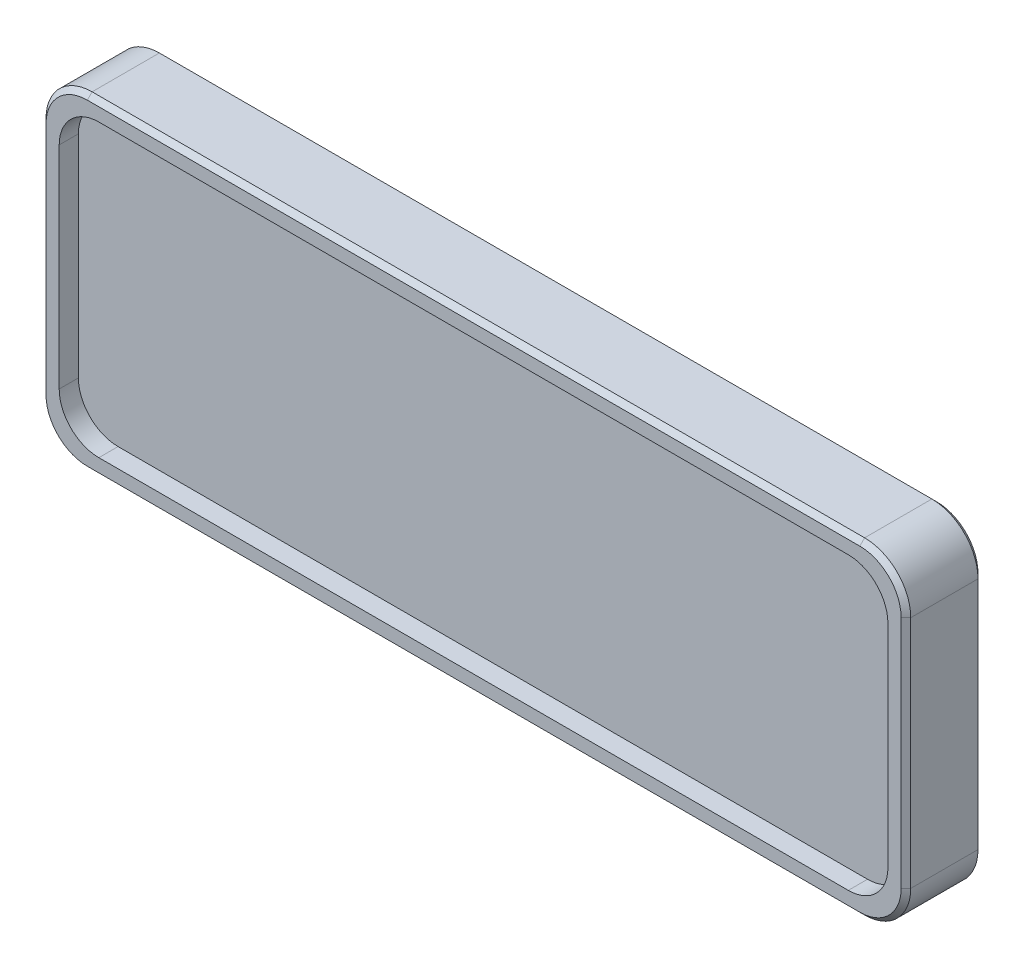
ISO-10303-21;
HEADER;
FILE_DESCRIPTION(('STEP AP214'),'2;1');
FILE_NAME('part.step','',(''),(''),'','','');
FILE_SCHEMA(('AUTOMOTIVE_DESIGN { 1 0 10303 214 1 1 1 1 }'));
ENDSEC;
DATA;
#1=APPLICATION_CONTEXT('core data for automotive mechanical design processes');
#2=APPLICATION_PROTOCOL_DEFINITION('international standard','automotive_design',2000,#1);
#3=PRODUCT_CONTEXT('',#1,'mechanical');
#4=PRODUCT('Part','Part','',(#3));
#5=PRODUCT_RELATED_PRODUCT_CATEGORY('part','',(#4));
#6=PRODUCT_DEFINITION_FORMATION('','',#4);
#7=PRODUCT_DEFINITION_CONTEXT('part definition',#1,'design');
#8=PRODUCT_DEFINITION('design','',#6,#7);
#9=PRODUCT_DEFINITION_SHAPE('','',#8);
#10=(LENGTH_UNIT() NAMED_UNIT(*) SI_UNIT(.MILLI.,.METRE.));
#11=(NAMED_UNIT(*) PLANE_ANGLE_UNIT() SI_UNIT($,.RADIAN.));
#12=(NAMED_UNIT(*) SI_UNIT($,.STERADIAN.) SOLID_ANGLE_UNIT());
#13=UNCERTAINTY_MEASURE_WITH_UNIT(LENGTH_MEASURE(1.E-05),#10,'distance_accuracy_value','');
#14=(GEOMETRIC_REPRESENTATION_CONTEXT(3) GLOBAL_UNCERTAINTY_ASSIGNED_CONTEXT((#13)) GLOBAL_UNIT_ASSIGNED_CONTEXT((#10,
#11,#12)) REPRESENTATION_CONTEXT('',''));
#15=CARTESIAN_POINT('',(0.,0.,0.));
#16=DIRECTION('',(0.,0.,1.));
#17=DIRECTION('',(1.,0.,0.));
#18=AXIS2_PLACEMENT_3D('',#15,#16,#17);
#19=CARTESIAN_POINT('',(-63.8175,19.3675,-12.7));
#20=DIRECTION('',(0.,0.,1.));
#21=DIRECTION('',(1.,0.,0.));
#22=AXIS2_PLACEMENT_3D('',#19,#20,#21);
#23=CYLINDRICAL_SURFACE('',#22,7.61999999999999);
#24=DIRECTION('',(0.,0.,1.));
#25=VECTOR('',#24,1.);
#26=CARTESIAN_POINT('',(-63.8175,26.9875,-12.7));
#27=LINE('',#26,#25);
#28=CARTESIAN_POINT('',(-63.8175,26.9875,-11.90625));
#29=VERTEX_POINT('',#28);
#30=CARTESIAN_POINT('',(-63.8175,26.9875,-0.793749999999982));
#31=VERTEX_POINT('',#30);
#32=EDGE_CURVE('E316',#29,#31,#27,.T.);
#33=ORIENTED_EDGE('',*,*,#32,.F.);
#34=CARTESIAN_POINT('',(-63.8175,19.3675,-11.90625));
#35=DIRECTION('',(0.,0.,1.));
#36=DIRECTION('',(1.,0.,0.));
#37=AXIS2_PLACEMENT_3D('',#34,#35,#36);
#38=CIRCLE('',#37,7.61999999999999);
#39=CARTESIAN_POINT('',(-71.4375,19.3675,-11.90625));
#40=VERTEX_POINT('',#39);
#41=EDGE_CURVE('E388',#29,#40,#38,.T.);
#42=ORIENTED_EDGE('',*,*,#41,.T.);
#43=DIRECTION('',(0.,0.,1.));
#44=VECTOR('',#43,1.);
#45=CARTESIAN_POINT('',(-71.4375,19.3675,-12.7));
#46=LINE('',#45,#44);
#47=CARTESIAN_POINT('',(-71.4375,19.3675,-0.793749999999982));
#48=VERTEX_POINT('',#47);
#49=EDGE_CURVE('E298',#40,#48,#46,.T.);
#50=ORIENTED_EDGE('',*,*,#49,.T.);
#51=CARTESIAN_POINT('',(-63.8175,19.3675,-0.793749999999982));
#52=DIRECTION('',(0.,0.,1.));
#53=DIRECTION('',(1.,0.,0.));
#54=AXIS2_PLACEMENT_3D('',#51,#52,#53);
#55=CIRCLE('',#54,7.61999999999999);
#56=EDGE_CURVE('E385',#48,#31,#55,.F.);
#57=ORIENTED_EDGE('',*,*,#56,.T.);
#58=EDGE_LOOP('',(#33,#42,#50,#57));
#59=FACE_BOUND('',#58,.T.);
#60=ADVANCED_FACE('F47',(#59),#23,.T.);
#61=CARTESIAN_POINT('',(-63.8175,26.9875,-12.7));
#62=DIRECTION('',(0.,1.,0.));
#63=DIRECTION('',(-1.,0.,0.));
#64=AXIS2_PLACEMENT_3D('',#61,#62,#63);
#65=PLANE('',#64);
#66=DIRECTION('',(0.,0.,1.));
#67=VECTOR('',#66,1.);
#68=CARTESIAN_POINT('',(63.8175,26.9875,-12.7));
#69=LINE('',#68,#67);
#70=CARTESIAN_POINT('',(63.8175,26.9875,-11.90625));
#71=VERTEX_POINT('',#70);
#72=CARTESIAN_POINT('',(63.8175,26.9875,-0.793749999999982));
#73=VERTEX_POINT('',#72);
#74=EDGE_CURVE('E321',#71,#73,#69,.T.);
#75=ORIENTED_EDGE('',*,*,#74,.F.);
#76=DIRECTION('',(-1.,0.,0.));
#77=VECTOR('',#76,1.);
#78=CARTESIAN_POINT('',(-63.8175,26.9875,-11.90625));
#79=LINE('',#78,#77);
#80=EDGE_CURVE('E356',#71,#29,#79,.T.);
#81=ORIENTED_EDGE('',*,*,#80,.T.);
#82=ORIENTED_EDGE('',*,*,#32,.T.);
#83=DIRECTION('',(1.,0.,0.));
#84=VECTOR('',#83,1.);
#85=CARTESIAN_POINT('',(-63.8175,26.9875,-0.793749999999982));
#86=LINE('',#85,#84);
#87=EDGE_CURVE('E320',#31,#73,#86,.T.);
#88=ORIENTED_EDGE('',*,*,#87,.T.);
#89=EDGE_LOOP('',(#75,#81,#82,#88));
#90=FACE_BOUND('',#89,.T.);
#91=ADVANCED_FACE('F569',(#90),#65,.T.);
#92=CARTESIAN_POINT('',(63.8175,19.3675,-12.7));
#93=DIRECTION('',(0.,0.,1.));
#94=DIRECTION('',(1.,0.,0.));
#95=AXIS2_PLACEMENT_3D('',#92,#93,#94);
#96=CYLINDRICAL_SURFACE('',#95,7.62000000000001);
#97=DIRECTION('',(0.,0.,1.));
#98=VECTOR('',#97,1.);
#99=CARTESIAN_POINT('',(71.4375,19.3675,-12.7));
#100=LINE('',#99,#98);
#101=CARTESIAN_POINT('',(71.4375,19.3675,-11.90625));
#102=VERTEX_POINT('',#101);
#103=CARTESIAN_POINT('',(71.4375,19.3675,-0.793749999999982));
#104=VERTEX_POINT('',#103);
#105=EDGE_CURVE('E325',#102,#104,#100,.T.);
#106=ORIENTED_EDGE('',*,*,#105,.F.);
#107=CARTESIAN_POINT('',(63.8175,19.3675,-11.90625));
#108=DIRECTION('',(0.,0.,1.));
#109=DIRECTION('',(1.,0.,0.));
#110=AXIS2_PLACEMENT_3D('',#107,#108,#109);
#111=CIRCLE('',#110,7.62000000000001);
#112=EDGE_CURVE('E394',#102,#71,#111,.T.);
#113=ORIENTED_EDGE('',*,*,#112,.T.);
#114=ORIENTED_EDGE('',*,*,#74,.T.);
#115=CARTESIAN_POINT('',(63.8175,19.3675,-0.793749999999982));
#116=DIRECTION('',(0.,0.,1.));
#117=DIRECTION('',(1.,0.,0.));
#118=AXIS2_PLACEMENT_3D('',#115,#116,#117);
#119=CIRCLE('',#118,7.62000000000001);
#120=EDGE_CURVE('E391',#73,#104,#119,.F.);
#121=ORIENTED_EDGE('',*,*,#120,.T.);
#122=EDGE_LOOP('',(#106,#113,#114,#121));
#123=FACE_BOUND('',#122,.T.);
#124=ADVANCED_FACE('F567',(#123),#96,.T.);
#125=CARTESIAN_POINT('',(71.4375,-19.3675,-12.7));
#126=DIRECTION('',(1.,0.,0.));
#127=DIRECTION('',(0.,0.,-1.));
#128=AXIS2_PLACEMENT_3D('',#125,#126,#127);
#129=PLANE('',#128);
#130=DIRECTION('',(0.,0.,1.));
#131=VECTOR('',#130,1.);
#132=CARTESIAN_POINT('',(71.4375,-19.3675,-12.7));
#133=LINE('',#132,#131);
#134=CARTESIAN_POINT('',(71.4375,-19.3675,-11.90625));
#135=VERTEX_POINT('',#134);
#136=CARTESIAN_POINT('',(71.4375,-19.3675,-0.793749999999982));
#137=VERTEX_POINT('',#136);
#138=EDGE_CURVE('E329',#135,#137,#133,.T.);
#139=ORIENTED_EDGE('',*,*,#138,.F.);
#140=DIRECTION('',(0.,1.,0.));
#141=VECTOR('',#140,1.);
#142=CARTESIAN_POINT('',(71.4375,19.3675,-11.90625));
#143=LINE('',#142,#141);
#144=EDGE_CURVE('E406',#135,#102,#143,.T.);
#145=ORIENTED_EDGE('',*,*,#144,.T.);
#146=ORIENTED_EDGE('',*,*,#105,.T.);
#147=DIRECTION('',(0.,-1.,0.));
#148=VECTOR('',#147,1.);
#149=CARTESIAN_POINT('',(71.4375,-19.3675,-0.793749999999982));
#150=LINE('',#149,#148);
#151=EDGE_CURVE('E403',#104,#137,#150,.T.);
#152=ORIENTED_EDGE('',*,*,#151,.T.);
#153=EDGE_LOOP('',(#139,#145,#146,#152));
#154=FACE_BOUND('',#153,.T.);
#155=ADVANCED_FACE('F549',(#154),#129,.T.);
#156=CARTESIAN_POINT('',(63.8175,-19.3675,-12.7));
#157=DIRECTION('',(0.,0.,1.));
#158=DIRECTION('',(1.,0.,0.));
#159=AXIS2_PLACEMENT_3D('',#156,#157,#158);
#160=CYLINDRICAL_SURFACE('',#159,7.62000000000001);
#161=DIRECTION('',(0.,0.,1.));
#162=VECTOR('',#161,1.);
#163=CARTESIAN_POINT('',(63.8175,-26.9875,-12.7));
#164=LINE('',#163,#162);
#165=CARTESIAN_POINT('',(63.8175,-26.9875,-11.90625));
#166=VERTEX_POINT('',#165);
#167=CARTESIAN_POINT('',(63.8175,-26.9875,-0.793749999999982));
#168=VERTEX_POINT('',#167);
#169=EDGE_CURVE('E333',#166,#168,#164,.T.);
#170=ORIENTED_EDGE('',*,*,#169,.F.);
#171=CARTESIAN_POINT('',(63.8175,-19.3675,-11.90625));
#172=DIRECTION('',(0.,0.,1.));
#173=DIRECTION('',(1.,0.,0.));
#174=AXIS2_PLACEMENT_3D('',#171,#172,#173);
#175=CIRCLE('',#174,7.62000000000001);
#176=EDGE_CURVE('E418',#166,#135,#175,.T.);
#177=ORIENTED_EDGE('',*,*,#176,.T.);
#178=ORIENTED_EDGE('',*,*,#138,.T.);
#179=CARTESIAN_POINT('',(63.8175,-19.3675,-0.793749999999982));
#180=DIRECTION('',(0.,0.,1.));
#181=DIRECTION('',(1.,0.,0.));
#182=AXIS2_PLACEMENT_3D('',#179,#180,#181);
#183=CIRCLE('',#182,7.62000000000001);
#184=EDGE_CURVE('E415',#137,#168,#183,.F.);
#185=ORIENTED_EDGE('',*,*,#184,.T.);
#186=EDGE_LOOP('',(#170,#177,#178,#185));
#187=FACE_BOUND('',#186,.T.);
#188=ADVANCED_FACE('F545',(#187),#160,.T.);
#189=CARTESIAN_POINT('',(-63.8175,-26.9875,-12.7));
#190=DIRECTION('',(0.,-1.,0.));
#191=DIRECTION('',(1.,0.,0.));
#192=AXIS2_PLACEMENT_3D('',#189,#190,#191);
#193=PLANE('',#192);
#194=CARTESIAN_POINT('',(0.,-26.9875,-6.34999999999884));
#195=DIRECTION('',(0.,-1.,0.));
#196=DIRECTION('',(1.,0.,0.));
#197=AXIS2_PLACEMENT_3D('',#194,#195,#196);
#198=CIRCLE('',#197,3.571875);
#199=CARTESIAN_POINT('',(3.57187499999996,-26.9875,-6.34999999999884));
#200=VERTEX_POINT('',#199);
#201=EDGE_CURVE('E476',#200,#200,#198,.T.);
#202=ORIENTED_EDGE('',*,*,#201,.F.);
#203=EDGE_LOOP('',(#202));
#204=FACE_BOUND('',#203,.T.);
#205=DIRECTION('',(0.,0.,1.));
#206=VECTOR('',#205,1.);
#207=CARTESIAN_POINT('',(-63.8175,-26.9875,-12.7));
#208=LINE('',#207,#206);
#209=CARTESIAN_POINT('',(-63.8175,-26.9875,-11.90625));
#210=VERTEX_POINT('',#209);
#211=CARTESIAN_POINT('',(-63.8175,-26.9875,-0.793749999999982));
#212=VERTEX_POINT('',#211);
#213=EDGE_CURVE('E337',#210,#212,#208,.T.);
#214=ORIENTED_EDGE('',*,*,#213,.F.);
#215=DIRECTION('',(1.,0.,0.));
#216=VECTOR('',#215,1.);
#217=CARTESIAN_POINT('',(63.8175,-26.9875,-11.90625));
#218=LINE('',#217,#216);
#219=EDGE_CURVE('E424',#210,#166,#218,.T.);
#220=ORIENTED_EDGE('',*,*,#219,.T.);
#221=ORIENTED_EDGE('',*,*,#169,.T.);
#222=DIRECTION('',(-1.,0.,0.));
#223=VECTOR('',#222,1.);
#224=CARTESIAN_POINT('',(-63.8175,-26.9875,-0.793749999999982));
#225=LINE('',#224,#223);
#226=EDGE_CURVE('E421',#168,#212,#225,.T.);
#227=ORIENTED_EDGE('',*,*,#226,.T.);
#228=EDGE_LOOP('',(#214,#220,#221,#227));
#229=FACE_BOUND('',#228,.T.);
#230=ADVANCED_FACE('F517',(#204,#229),#193,.T.);
#231=CARTESIAN_POINT('',(-63.8175,-19.3675,-12.7));
#232=DIRECTION('',(0.,0.,1.));
#233=DIRECTION('',(1.,0.,0.));
#234=AXIS2_PLACEMENT_3D('',#231,#232,#233);
#235=CYLINDRICAL_SURFACE('',#234,7.61999999999999);
#236=DIRECTION('',(0.,0.,1.));
#237=VECTOR('',#236,1.);
#238=CARTESIAN_POINT('',(-71.4375,-19.3675,-12.7));
#239=LINE('',#238,#237);
#240=CARTESIAN_POINT('',(-71.4375,-19.3675,-11.90625));
#241=VERTEX_POINT('',#240);
#242=CARTESIAN_POINT('',(-71.4375,-19.3675,-0.793749999999982));
#243=VERTEX_POINT('',#242);
#244=EDGE_CURVE('E341',#241,#243,#239,.T.);
#245=ORIENTED_EDGE('',*,*,#244,.F.);
#246=CARTESIAN_POINT('',(-63.8175,-19.3675,-11.90625));
#247=DIRECTION('',(0.,0.,1.));
#248=DIRECTION('',(1.,0.,0.));
#249=AXIS2_PLACEMENT_3D('',#246,#247,#248);
#250=CIRCLE('',#249,7.61999999999999);
#251=EDGE_CURVE('E412',#241,#210,#250,.T.);
#252=ORIENTED_EDGE('',*,*,#251,.T.);
#253=ORIENTED_EDGE('',*,*,#213,.T.);
#254=CARTESIAN_POINT('',(-63.8175,-19.3675,-0.793749999999982));
#255=DIRECTION('',(0.,0.,1.));
#256=DIRECTION('',(1.,0.,0.));
#257=AXIS2_PLACEMENT_3D('',#254,#255,#256);
#258=CIRCLE('',#257,7.61999999999999);
#259=EDGE_CURVE('E409',#212,#243,#258,.F.);
#260=ORIENTED_EDGE('',*,*,#259,.T.);
#261=EDGE_LOOP('',(#245,#252,#253,#260));
#262=FACE_BOUND('',#261,.T.);
#263=ADVANCED_FACE('F522',(#262),#235,.T.);
#264=CARTESIAN_POINT('',(-71.4375,-19.3675,-12.7));
#265=DIRECTION('',(-1.,0.,0.));
#266=DIRECTION('',(0.,0.,1.));
#267=AXIS2_PLACEMENT_3D('',#264,#265,#266);
#268=PLANE('',#267);
#269=ORIENTED_EDGE('',*,*,#49,.F.);
#270=DIRECTION('',(0.,-1.,0.));
#271=VECTOR('',#270,1.);
#272=CARTESIAN_POINT('',(-71.4375,-19.3675,-11.90625));
#273=LINE('',#272,#271);
#274=EDGE_CURVE('E400',#40,#241,#273,.T.);
#275=ORIENTED_EDGE('',*,*,#274,.T.);
#276=ORIENTED_EDGE('',*,*,#244,.T.);
#277=DIRECTION('',(0.,1.,0.));
#278=VECTOR('',#277,1.);
#279=CARTESIAN_POINT('',(-71.4375,-19.3675,-0.793749999999982));
#280=LINE('',#279,#278);
#281=EDGE_CURVE('E397',#243,#48,#280,.T.);
#282=ORIENTED_EDGE('',*,*,#281,.T.);
#283=EDGE_LOOP('',(#269,#275,#276,#282));
#284=FACE_BOUND('',#283,.T.);
#285=ADVANCED_FACE('F622',(#284),#268,.T.);
#286=CARTESIAN_POINT('',(-63.8175,19.3675,-12.7));
#287=DIRECTION('',(0.,0.,1.));
#288=DIRECTION('',(1.,0.,0.));
#289=AXIS2_PLACEMENT_3D('',#286,#287,#288);
#290=PLANE('',#289);
#291=CARTESIAN_POINT('',(-63.8175,19.3675,-12.7));
#292=DIRECTION('',(0.,0.,1.));
#293=DIRECTION('',(1.,0.,0.));
#294=AXIS2_PLACEMENT_3D('',#291,#292,#293);
#295=CIRCLE('',#294,6.82624999999996);
#296=CARTESIAN_POINT('',(-70.64375,19.3675,-12.7));
#297=VERTEX_POINT('',#296);
#298=CARTESIAN_POINT('',(-63.8175,26.19375,-12.7));
#299=VERTEX_POINT('',#298);
#300=EDGE_CURVE('E378',#297,#299,#295,.F.);
#301=ORIENTED_EDGE('',*,*,#300,.T.);
#302=DIRECTION('',(1.,0.,0.));
#303=VECTOR('',#302,1.);
#304=CARTESIAN_POINT('',(63.8175,26.19375,-12.7));
#305=LINE('',#304,#303);
#306=CARTESIAN_POINT('',(63.8175,26.19375,-12.7));
#307=VERTEX_POINT('',#306);
#308=EDGE_CURVE('E381',#299,#307,#305,.T.);
#309=ORIENTED_EDGE('',*,*,#308,.T.);
#310=CARTESIAN_POINT('',(63.8175,19.3675,-12.7));
#311=DIRECTION('',(0.,0.,1.));
#312=DIRECTION('',(1.,0.,0.));
#313=AXIS2_PLACEMENT_3D('',#310,#311,#312);
#314=CIRCLE('',#313,6.82624999999998);
#315=CARTESIAN_POINT('',(70.64375,19.3675,-12.7));
#316=VERTEX_POINT('',#315);
#317=EDGE_CURVE('E375',#307,#316,#314,.F.);
#318=ORIENTED_EDGE('',*,*,#317,.T.);
#319=DIRECTION('',(0.,-1.,0.));
#320=VECTOR('',#319,1.);
#321=CARTESIAN_POINT('',(70.64375,-19.3675,-12.7));
#322=LINE('',#321,#320);
#323=CARTESIAN_POINT('',(70.64375,-19.3675,-12.7));
#324=VERTEX_POINT('',#323);
#325=EDGE_CURVE('E369',#316,#324,#322,.T.);
#326=ORIENTED_EDGE('',*,*,#325,.T.);
#327=CARTESIAN_POINT('',(63.8175,-19.3675,-12.7));
#328=DIRECTION('',(0.,0.,1.));
#329=DIRECTION('',(1.,0.,0.));
#330=AXIS2_PLACEMENT_3D('',#327,#328,#329);
#331=CIRCLE('',#330,6.82624999999998);
#332=CARTESIAN_POINT('',(63.8175,-26.19375,-12.7));
#333=VERTEX_POINT('',#332);
#334=EDGE_CURVE('E363',#324,#333,#331,.F.);
#335=ORIENTED_EDGE('',*,*,#334,.T.);
#336=DIRECTION('',(-1.,0.,0.));
#337=VECTOR('',#336,1.);
#338=CARTESIAN_POINT('',(-63.8175,-26.19375,-12.7));
#339=LINE('',#338,#337);
#340=CARTESIAN_POINT('',(-63.8175,-26.19375,-12.7));
#341=VERTEX_POINT('',#340);
#342=EDGE_CURVE('E360',#333,#341,#339,.T.);
#343=ORIENTED_EDGE('',*,*,#342,.T.);
#344=CARTESIAN_POINT('',(-63.8175,-19.3675,-12.7));
#345=DIRECTION('',(0.,0.,1.));
#346=DIRECTION('',(1.,0.,0.));
#347=AXIS2_PLACEMENT_3D('',#344,#345,#346);
#348=CIRCLE('',#347,6.82624999999998);
#349=CARTESIAN_POINT('',(-70.64375,-19.3675,-12.7));
#350=VERTEX_POINT('',#349);
#351=EDGE_CURVE('E366',#341,#350,#348,.F.);
#352=ORIENTED_EDGE('',*,*,#351,.T.);
#353=DIRECTION('',(0.,1.,0.));
#354=VECTOR('',#353,1.);
#355=CARTESIAN_POINT('',(-70.64375,19.3675,-12.7));
#356=LINE('',#355,#354);
#357=EDGE_CURVE('E372',#350,#297,#356,.T.);
#358=ORIENTED_EDGE('',*,*,#357,.T.);
#359=EDGE_LOOP('',(#301,#309,#318,#326,#335,#343,#352,#358));
#360=FACE_BOUND('',#359,.T.);
#361=ADVANCED_FACE('F536',(#360),#290,.F.);
#362=CARTESIAN_POINT('',(-63.8175,19.3675,0.));
#363=DIRECTION('',(0.,0.,1.));
#364=DIRECTION('',(1.,0.,0.));
#365=AXIS2_PLACEMENT_3D('',#362,#363,#364);
#366=PLANE('',#365);
#367=CARTESIAN_POINT('',(63.8175,19.3675,0.));
#368=DIRECTION('',(0.,0.,1.));
#369=DIRECTION('',(1.,0.,0.));
#370=AXIS2_PLACEMENT_3D('',#367,#368,#369);
#371=CIRCLE('',#370,6.82625000000002);
#372=CARTESIAN_POINT('',(70.64375,19.3675,0.));
#373=VERTEX_POINT('',#372);
#374=CARTESIAN_POINT('',(63.8175,26.19375,0.));
#375=VERTEX_POINT('',#374);
#376=EDGE_CURVE('E73',#373,#375,#371,.T.);
#377=ORIENTED_EDGE('',*,*,#376,.T.);
#378=DIRECTION('',(-1.,0.,0.));
#379=VECTOR('',#378,1.);
#380=CARTESIAN_POINT('',(-63.8175,26.19375,0.));
#381=LINE('',#380,#379);
#382=CARTESIAN_POINT('',(-63.8175,26.19375,0.));
#383=VERTEX_POINT('',#382);
#384=EDGE_CURVE('E11',#375,#383,#381,.T.);
#385=ORIENTED_EDGE('',*,*,#384,.T.);
#386=CARTESIAN_POINT('',(-63.8175,19.3675,0.));
#387=DIRECTION('',(0.,0.,1.));
#388=DIRECTION('',(1.,0.,0.));
#389=AXIS2_PLACEMENT_3D('',#386,#387,#388);
#390=CIRCLE('',#389,6.82625000000002);
#391=CARTESIAN_POINT('',(-70.64375,19.3675,0.));
#392=VERTEX_POINT('',#391);
#393=EDGE_CURVE('E58',#383,#392,#390,.T.);
#394=ORIENTED_EDGE('',*,*,#393,.T.);
#395=DIRECTION('',(0.,-1.,0.));
#396=VECTOR('',#395,1.);
#397=CARTESIAN_POINT('',(-70.64375,19.3675,0.));
#398=LINE('',#397,#396);
#399=CARTESIAN_POINT('',(-70.64375,-19.3675,0.));
#400=VERTEX_POINT('',#399);
#401=EDGE_CURVE('E439',#392,#400,#398,.T.);
#402=ORIENTED_EDGE('',*,*,#401,.T.);
#403=CARTESIAN_POINT('',(-63.8175,-19.3675,0.));
#404=DIRECTION('',(0.,0.,1.));
#405=DIRECTION('',(1.,0.,0.));
#406=AXIS2_PLACEMENT_3D('',#403,#404,#405);
#407=CIRCLE('',#406,6.82625000000001);
#408=CARTESIAN_POINT('',(-63.8175,-26.19375,0.));
#409=VERTEX_POINT('',#408);
#410=EDGE_CURVE('E433',#400,#409,#407,.T.);
#411=ORIENTED_EDGE('',*,*,#410,.T.);
#412=DIRECTION('',(1.,0.,0.));
#413=VECTOR('',#412,1.);
#414=CARTESIAN_POINT('',(-63.8175,-26.19375,0.));
#415=LINE('',#414,#413);
#416=CARTESIAN_POINT('',(63.8175,-26.19375,0.));
#417=VERTEX_POINT('',#416);
#418=EDGE_CURVE('E427',#409,#417,#415,.T.);
#419=ORIENTED_EDGE('',*,*,#418,.T.);
#420=CARTESIAN_POINT('',(63.8175,-19.3675,0.));
#421=DIRECTION('',(0.,0.,1.));
#422=DIRECTION('',(1.,0.,0.));
#423=AXIS2_PLACEMENT_3D('',#420,#421,#422);
#424=CIRCLE('',#423,6.82625000000002);
#425=CARTESIAN_POINT('',(70.64375,-19.3675,0.));
#426=VERTEX_POINT('',#425);
#427=EDGE_CURVE('E430',#417,#426,#424,.T.);
#428=ORIENTED_EDGE('',*,*,#427,.T.);
#429=DIRECTION('',(0.,1.,0.));
#430=VECTOR('',#429,1.);
#431=CARTESIAN_POINT('',(70.64375,19.3675,0.));
#432=LINE('',#431,#430);
#433=EDGE_CURVE('E436',#426,#373,#432,.T.);
#434=ORIENTED_EDGE('',*,*,#433,.T.);
#435=EDGE_LOOP('',(#377,#385,#394,#402,#411,#419,#428,#434));
#436=FACE_BOUND('',#435,.T.);
#437=CARTESIAN_POINT('',(61.9125,-17.4624999999999,0.));
#438=DIRECTION('',(0.,0.,1.));
#439=DIRECTION('',(1.,0.,0.));
#440=AXIS2_PLACEMENT_3D('',#437,#438,#439);
#441=CIRCLE('',#440,6.55);
#442=CARTESIAN_POINT('',(61.9125,-24.0124999999999,0.));
#443=VERTEX_POINT('',#442);
#444=CARTESIAN_POINT('',(68.4625,-17.4624999999998,0.));
#445=VERTEX_POINT('',#444);
#446=EDGE_CURVE('E221',#443,#445,#441,.T.);
#447=ORIENTED_EDGE('',*,*,#446,.F.);
#448=DIRECTION('',(1.,0.,0.));
#449=VECTOR('',#448,1.);
#450=CARTESIAN_POINT('',(-61.9124999999999,-24.0124999999999,0.));
#451=LINE('',#450,#449);
#452=CARTESIAN_POINT('',(-61.9124999999999,-24.0124999999999,0.));
#453=VERTEX_POINT('',#452);
#454=EDGE_CURVE('E242',#453,#443,#451,.T.);
#455=ORIENTED_EDGE('',*,*,#454,.F.);
#456=CARTESIAN_POINT('',(-61.9125,-17.4624999999999,0.));
#457=DIRECTION('',(0.,0.,1.));
#458=DIRECTION('',(1.,0.,0.));
#459=AXIS2_PLACEMENT_3D('',#456,#457,#458);
#460=CIRCLE('',#459,6.55);
#461=CARTESIAN_POINT('',(-68.4625,-17.4624999999998,0.));
#462=VERTEX_POINT('',#461);
#463=EDGE_CURVE('E246',#462,#453,#460,.T.);
#464=ORIENTED_EDGE('',*,*,#463,.F.);
#465=DIRECTION('',(0.,-1.,0.));
#466=VECTOR('',#465,1.);
#467=CARTESIAN_POINT('',(-68.4625,17.4625000000001,0.));
#468=LINE('',#467,#466);
#469=CARTESIAN_POINT('',(-68.4625,17.4625000000001,0.));
#470=VERTEX_POINT('',#469);
#471=EDGE_CURVE('E288',#470,#462,#468,.T.);
#472=ORIENTED_EDGE('',*,*,#471,.F.);
#473=CARTESIAN_POINT('',(-61.9125,17.4625000000001,0.));
#474=DIRECTION('',(0.,0.,1.));
#475=DIRECTION('',(1.,0.,0.));
#476=AXIS2_PLACEMENT_3D('',#473,#474,#475);
#477=CIRCLE('',#476,6.55);
#478=CARTESIAN_POINT('',(-61.9124999999999,24.0125000000001,0.));
#479=VERTEX_POINT('',#478);
#480=EDGE_CURVE('E284',#479,#470,#477,.T.);
#481=ORIENTED_EDGE('',*,*,#480,.F.);
#482=DIRECTION('',(-1.,0.,0.));
#483=VECTOR('',#482,1.);
#484=CARTESIAN_POINT('',(61.9124999999999,24.0125000000001,0.));
#485=LINE('',#484,#483);
#486=CARTESIAN_POINT('',(61.9124999999999,24.0125000000001,0.));
#487=VERTEX_POINT('',#486);
#488=EDGE_CURVE('E280',#487,#479,#485,.T.);
#489=ORIENTED_EDGE('',*,*,#488,.F.);
#490=CARTESIAN_POINT('',(61.9125,17.4625000000001,0.));
#491=DIRECTION('',(0.,0.,1.));
#492=DIRECTION('',(1.,0.,0.));
#493=AXIS2_PLACEMENT_3D('',#490,#491,#492);
#494=CIRCLE('',#493,6.55);
#495=CARTESIAN_POINT('',(68.4625,17.4625000000001,0.));
#496=VERTEX_POINT('',#495);
#497=EDGE_CURVE('E276',#496,#487,#494,.T.);
#498=ORIENTED_EDGE('',*,*,#497,.F.);
#499=DIRECTION('',(0.,1.,0.));
#500=VECTOR('',#499,1.);
#501=CARTESIAN_POINT('',(68.4625,-17.4624999999998,0.));
#502=LINE('',#501,#500);
#503=EDGE_CURVE('E273',#445,#496,#502,.T.);
#504=ORIENTED_EDGE('',*,*,#503,.F.);
#505=EDGE_LOOP('',(#447,#455,#464,#472,#481,#489,#498,#504));
#506=FACE_BOUND('',#505,.T.);
#507=ADVANCED_FACE('F578',(#436,#506),#366,.T.);
#508=CARTESIAN_POINT('',(61.9125,-17.4624999999999,-3.175));
#509=DIRECTION('',(0.,0.,1.));
#510=DIRECTION('',(1.,0.,0.));
#511=AXIS2_PLACEMENT_3D('',#508,#509,#510);
#512=CYLINDRICAL_SURFACE('',#511,6.55);
#513=ORIENTED_EDGE('',*,*,#446,.T.);
#514=DIRECTION('',(0.,0.,1.));
#515=VECTOR('',#514,1.);
#516=CARTESIAN_POINT('',(68.4625,-17.4624999999998,-3.175));
#517=LINE('',#516,#515);
#518=CARTESIAN_POINT('',(68.4625,-17.4624999999998,-3.175));
#519=VERTEX_POINT('',#518);
#520=EDGE_CURVE('E214',#519,#445,#517,.T.);
#521=ORIENTED_EDGE('',*,*,#520,.F.);
#522=CARTESIAN_POINT('',(61.9125,-17.4624999999999,-3.175));
#523=DIRECTION('',(0.,0.,1.));
#524=DIRECTION('',(1.,0.,0.));
#525=AXIS2_PLACEMENT_3D('',#522,#523,#524);
#526=CIRCLE('',#525,6.55);
#527=CARTESIAN_POINT('',(61.9125,-24.0124999999999,-3.175));
#528=VERTEX_POINT('',#527);
#529=EDGE_CURVE('E218',#528,#519,#526,.T.);
#530=ORIENTED_EDGE('',*,*,#529,.F.);
#531=DIRECTION('',(0.,0.,1.));
#532=VECTOR('',#531,1.);
#533=CARTESIAN_POINT('',(61.9125,-24.0124999999999,-3.175));
#534=LINE('',#533,#532);
#535=EDGE_CURVE('E295',#528,#443,#534,.T.);
#536=ORIENTED_EDGE('',*,*,#535,.T.);
#537=EDGE_LOOP('',(#513,#521,#530,#536));
#538=FACE_BOUND('',#537,.T.);
#539=ADVANCED_FACE('F216',(#538),#512,.F.);
#540=CARTESIAN_POINT('',(-61.9124999999999,-24.0124999999999,-3.175));
#541=DIRECTION('',(0.,-1.,0.));
#542=DIRECTION('',(0.,0.,-1.));
#543=AXIS2_PLACEMENT_3D('',#540,#541,#542);
#544=PLANE('',#543);
#545=ORIENTED_EDGE('',*,*,#454,.T.);
#546=ORIENTED_EDGE('',*,*,#535,.F.);
#547=DIRECTION('',(1.,0.,0.));
#548=VECTOR('',#547,1.);
#549=CARTESIAN_POINT('',(-61.9124999999999,-24.0124999999999,-3.175));
#550=LINE('',#549,#548);
#551=CARTESIAN_POINT('',(-61.9124999999999,-24.0124999999999,-3.175));
#552=VERTEX_POINT('',#551);
#553=EDGE_CURVE('E227',#552,#528,#550,.T.);
#554=ORIENTED_EDGE('',*,*,#553,.F.);
#555=DIRECTION('',(0.,0.,1.));
#556=VECTOR('',#555,1.);
#557=CARTESIAN_POINT('',(-61.9124999999999,-24.0124999999999,-3.175));
#558=LINE('',#557,#556);
#559=EDGE_CURVE('E299',#552,#453,#558,.T.);
#560=ORIENTED_EDGE('',*,*,#559,.T.);
#561=EDGE_LOOP('',(#545,#546,#554,#560));
#562=FACE_BOUND('',#561,.T.);
#563=ADVANCED_FACE('F602',(#562),#544,.F.);
#564=CARTESIAN_POINT('',(-61.9125,-17.4624999999999,-3.175));
#565=DIRECTION('',(0.,0.,1.));
#566=DIRECTION('',(1.,0.,0.));
#567=AXIS2_PLACEMENT_3D('',#564,#565,#566);
#568=CYLINDRICAL_SURFACE('',#567,6.55);
#569=ORIENTED_EDGE('',*,*,#463,.T.);
#570=ORIENTED_EDGE('',*,*,#559,.F.);
#571=CARTESIAN_POINT('',(-61.9125,-17.4624999999999,-3.175));
#572=DIRECTION('',(0.,0.,1.));
#573=DIRECTION('',(1.,0.,0.));
#574=AXIS2_PLACEMENT_3D('',#571,#572,#573);
#575=CIRCLE('',#574,6.55);
#576=CARTESIAN_POINT('',(-68.4625,-17.4624999999998,-3.175));
#577=VERTEX_POINT('',#576);
#578=EDGE_CURVE('E266',#577,#552,#575,.T.);
#579=ORIENTED_EDGE('',*,*,#578,.F.);
#580=DIRECTION('',(0.,0.,1.));
#581=VECTOR('',#580,1.);
#582=CARTESIAN_POINT('',(-68.4625,-17.4624999999998,-3.175));
#583=LINE('',#582,#581);
#584=EDGE_CURVE('E302',#577,#462,#583,.T.);
#585=ORIENTED_EDGE('',*,*,#584,.T.);
#586=EDGE_LOOP('',(#569,#570,#579,#585));
#587=FACE_BOUND('',#586,.T.);
#588=ADVANCED_FACE('F603',(#587),#568,.F.);
#589=CARTESIAN_POINT('',(-68.4625,17.4625000000001,-3.175));
#590=DIRECTION('',(-1.,0.,0.));
#591=DIRECTION('',(0.,0.,1.));
#592=AXIS2_PLACEMENT_3D('',#589,#590,#591);
#593=PLANE('',#592);
#594=ORIENTED_EDGE('',*,*,#471,.T.);
#595=ORIENTED_EDGE('',*,*,#584,.F.);
#596=DIRECTION('',(0.,-1.,0.));
#597=VECTOR('',#596,1.);
#598=CARTESIAN_POINT('',(-68.4625,17.4625000000001,-3.175));
#599=LINE('',#598,#597);
#600=CARTESIAN_POINT('',(-68.4625,17.4625000000001,-3.175));
#601=VERTEX_POINT('',#600);
#602=EDGE_CURVE('E262',#601,#577,#599,.T.);
#603=ORIENTED_EDGE('',*,*,#602,.F.);
#604=DIRECTION('',(0.,0.,1.));
#605=VECTOR('',#604,1.);
#606=CARTESIAN_POINT('',(-68.4625,17.4625000000001,-3.175));
#607=LINE('',#606,#605);
#608=EDGE_CURVE('E305',#601,#470,#607,.T.);
#609=ORIENTED_EDGE('',*,*,#608,.T.);
#610=EDGE_LOOP('',(#594,#595,#603,#609));
#611=FACE_BOUND('',#610,.T.);
#612=ADVANCED_FACE('F598',(#611),#593,.F.);
#613=CARTESIAN_POINT('',(-61.9125,17.4625000000001,-3.175));
#614=DIRECTION('',(0.,0.,1.));
#615=DIRECTION('',(1.,0.,0.));
#616=AXIS2_PLACEMENT_3D('',#613,#614,#615);
#617=CYLINDRICAL_SURFACE('',#616,6.55);
#618=ORIENTED_EDGE('',*,*,#480,.T.);
#619=ORIENTED_EDGE('',*,*,#608,.F.);
#620=CARTESIAN_POINT('',(-61.9125,17.4625000000001,-3.175));
#621=DIRECTION('',(0.,0.,1.));
#622=DIRECTION('',(1.,0.,0.));
#623=AXIS2_PLACEMENT_3D('',#620,#621,#622);
#624=CIRCLE('',#623,6.55);
#625=CARTESIAN_POINT('',(-61.9124999999999,24.0125000000001,-3.175));
#626=VERTEX_POINT('',#625);
#627=EDGE_CURVE('E258',#626,#601,#624,.T.);
#628=ORIENTED_EDGE('',*,*,#627,.F.);
#629=DIRECTION('',(0.,0.,1.));
#630=VECTOR('',#629,1.);
#631=CARTESIAN_POINT('',(-61.9124999999999,24.0125000000001,-3.175));
#632=LINE('',#631,#630);
#633=EDGE_CURVE('E308',#626,#479,#632,.T.);
#634=ORIENTED_EDGE('',*,*,#633,.T.);
#635=EDGE_LOOP('',(#618,#619,#628,#634));
#636=FACE_BOUND('',#635,.T.);
#637=ADVANCED_FACE('F594',(#636),#617,.F.);
#638=CARTESIAN_POINT('',(61.9124999999999,24.0125000000001,-3.175));
#639=DIRECTION('',(0.,1.,0.));
#640=DIRECTION('',(0.,0.,1.));
#641=AXIS2_PLACEMENT_3D('',#638,#639,#640);
#642=PLANE('',#641);
#643=ORIENTED_EDGE('',*,*,#488,.T.);
#644=ORIENTED_EDGE('',*,*,#633,.F.);
#645=DIRECTION('',(-1.,0.,0.));
#646=VECTOR('',#645,1.);
#647=CARTESIAN_POINT('',(61.9124999999999,24.0125000000001,-3.175));
#648=LINE('',#647,#646);
#649=CARTESIAN_POINT('',(61.9124999999999,24.0125000000001,-3.175));
#650=VERTEX_POINT('',#649);
#651=EDGE_CURVE('E254',#650,#626,#648,.T.);
#652=ORIENTED_EDGE('',*,*,#651,.F.);
#653=DIRECTION('',(0.,0.,1.));
#654=VECTOR('',#653,1.);
#655=CARTESIAN_POINT('',(61.9124999999999,24.0125000000001,-3.175));
#656=LINE('',#655,#654);
#657=EDGE_CURVE('E311',#650,#487,#656,.T.);
#658=ORIENTED_EDGE('',*,*,#657,.T.);
#659=EDGE_LOOP('',(#643,#644,#652,#658));
#660=FACE_BOUND('',#659,.T.);
#661=ADVANCED_FACE('F592',(#660),#642,.F.);
#662=CARTESIAN_POINT('',(61.9125,17.4625000000001,-3.175));
#663=DIRECTION('',(0.,0.,1.));
#664=DIRECTION('',(1.,0.,0.));
#665=AXIS2_PLACEMENT_3D('',#662,#663,#664);
#666=CYLINDRICAL_SURFACE('',#665,6.55);
#667=ORIENTED_EDGE('',*,*,#497,.T.);
#668=ORIENTED_EDGE('',*,*,#657,.F.);
#669=CARTESIAN_POINT('',(61.9125,17.4625000000001,-3.175));
#670=DIRECTION('',(0.,0.,1.));
#671=DIRECTION('',(1.,0.,0.));
#672=AXIS2_PLACEMENT_3D('',#669,#670,#671);
#673=CIRCLE('',#672,6.55);
#674=CARTESIAN_POINT('',(68.4625,17.4625000000001,-3.175));
#675=VERTEX_POINT('',#674);
#676=EDGE_CURVE('E236',#675,#650,#673,.T.);
#677=ORIENTED_EDGE('',*,*,#676,.F.);
#678=DIRECTION('',(0.,0.,1.));
#679=VECTOR('',#678,1.);
#680=CARTESIAN_POINT('',(68.4625,17.4625000000001,-3.175));
#681=LINE('',#680,#679);
#682=EDGE_CURVE('E226',#675,#496,#681,.T.);
#683=ORIENTED_EDGE('',*,*,#682,.T.);
#684=EDGE_LOOP('',(#667,#668,#677,#683));
#685=FACE_BOUND('',#684,.T.);
#686=ADVANCED_FACE('F588',(#685),#666,.F.);
#687=CARTESIAN_POINT('',(68.4625,-17.4624999999998,-3.175));
#688=DIRECTION('',(1.,0.,0.));
#689=DIRECTION('',(0.,0.,-1.));
#690=AXIS2_PLACEMENT_3D('',#687,#688,#689);
#691=PLANE('',#690);
#692=ORIENTED_EDGE('',*,*,#503,.T.);
#693=ORIENTED_EDGE('',*,*,#682,.F.);
#694=DIRECTION('',(0.,1.,0.));
#695=VECTOR('',#694,1.);
#696=CARTESIAN_POINT('',(68.4625,-17.4624999999998,-3.175));
#697=LINE('',#696,#695);
#698=EDGE_CURVE('E230',#519,#675,#697,.T.);
#699=ORIENTED_EDGE('',*,*,#698,.F.);
#700=ORIENTED_EDGE('',*,*,#520,.T.);
#701=EDGE_LOOP('',(#692,#693,#699,#700));
#702=FACE_BOUND('',#701,.T.);
#703=ADVANCED_FACE('F231',(#702),#691,.F.);
#704=CARTESIAN_POINT('',(61.9125,-17.4624999999999,-3.175));
#705=DIRECTION('',(0.,0.,1.));
#706=DIRECTION('',(1.,0.,0.));
#707=AXIS2_PLACEMENT_3D('',#704,#705,#706);
#708=PLANE('',#707);
#709=ORIENTED_EDGE('',*,*,#529,.T.);
#710=ORIENTED_EDGE('',*,*,#698,.T.);
#711=ORIENTED_EDGE('',*,*,#676,.T.);
#712=ORIENTED_EDGE('',*,*,#651,.T.);
#713=ORIENTED_EDGE('',*,*,#627,.T.);
#714=ORIENTED_EDGE('',*,*,#602,.T.);
#715=ORIENTED_EDGE('',*,*,#578,.T.);
#716=ORIENTED_EDGE('',*,*,#553,.T.);
#717=EDGE_LOOP('',(#709,#710,#711,#712,#713,#714,#715,#716));
#718=FACE_BOUND('',#717,.T.);
#719=ADVANCED_FACE('F238',(#718),#708,.T.);
#720=CARTESIAN_POINT('',(0.,-24.4475,-6.34999999999884));
#721=DIRECTION('',(0.,-1.,0.));
#722=DIRECTION('',(1.,0.,0.));
#723=AXIS2_PLACEMENT_3D('',#720,#721,#722);
#724=PLANE('',#723);
#725=CARTESIAN_POINT('',(0.,-24.4475,-6.34999999999884));
#726=DIRECTION('',(0.,-1.,0.));
#727=DIRECTION('',(1.,0.,0.));
#728=AXIS2_PLACEMENT_3D('',#725,#726,#727);
#729=CIRCLE('',#728,3.571875);
#730=CARTESIAN_POINT('',(3.57187499999996,-24.4475,-6.34999999999884));
#731=VERTEX_POINT('',#730);
#732=EDGE_CURVE('E352',#731,#731,#729,.T.);
#733=ORIENTED_EDGE('',*,*,#732,.T.);
#734=EDGE_LOOP('',(#733));
#735=FACE_BOUND('',#734,.T.);
#736=CARTESIAN_POINT('',(0.,-24.4475,-6.35));
#737=DIRECTION('',(0.,-1.,0.));
#738=DIRECTION('',(1.,0.,0.));
#739=AXIS2_PLACEMENT_3D('',#736,#737,#738);
#740=CIRCLE('',#739,2.8575);
#741=CARTESIAN_POINT('',(2.8575,-24.4475,-6.35));
#742=VERTEX_POINT('',#741);
#743=EDGE_CURVE('E348',#742,#742,#740,.F.);
#744=ORIENTED_EDGE('',*,*,#743,.T.);
#745=EDGE_LOOP('',(#744));
#746=FACE_BOUND('',#745,.T.);
#747=ADVANCED_FACE('F884',(#735,#746),#724,.T.);
#748=CARTESIAN_POINT('',(0.,-24.4475,-6.34999999999884));
#749=DIRECTION('',(0.,-1.,0.));
#750=DIRECTION('',(1.,0.,0.));
#751=AXIS2_PLACEMENT_3D('',#748,#749,#750);
#752=CYLINDRICAL_SURFACE('',#751,3.571875);
#753=ORIENTED_EDGE('',*,*,#732,.F.);
#754=EDGE_LOOP('',(#753));
#755=FACE_BOUND('',#754,.T.);
#756=ORIENTED_EDGE('',*,*,#201,.T.);
#757=EDGE_LOOP('',(#756));
#758=FACE_BOUND('',#757,.T.);
#759=ADVANCED_FACE('F893',(#755,#758),#752,.F.);
#760=CARTESIAN_POINT('',(0.,-1.5875,-6.35));
#761=DIRECTION('',(0.,-1.,0.));
#762=DIRECTION('',(1.,0.,0.));
#763=AXIS2_PLACEMENT_3D('',#760,#761,#762);
#764=PLANE('',#763);
#765=CARTESIAN_POINT('',(0.,-1.5875,-6.35));
#766=DIRECTION('',(0.,-1.,0.));
#767=DIRECTION('',(1.,0.,0.));
#768=AXIS2_PLACEMENT_3D('',#765,#766,#767);
#769=CIRCLE('',#768,2.8575);
#770=CARTESIAN_POINT('',(2.8575,-1.5875,-6.35));
#771=VERTEX_POINT('',#770);
#772=EDGE_CURVE('E249',#771,#771,#769,.T.);
#773=ORIENTED_EDGE('',*,*,#772,.T.);
#774=EDGE_LOOP('',(#773));
#775=FACE_BOUND('',#774,.T.);
#776=ADVANCED_FACE('F889',(#775),#764,.T.);
#777=CARTESIAN_POINT('',(0.,-1.5875,-6.35));
#778=DIRECTION('',(0.,-1.,0.));
#779=DIRECTION('',(1.,0.,0.));
#780=AXIS2_PLACEMENT_3D('',#777,#778,#779);
#781=CYLINDRICAL_SURFACE('',#780,2.8575);
#782=ORIENTED_EDGE('',*,*,#772,.F.);
#783=EDGE_LOOP('',(#782));
#784=FACE_BOUND('',#783,.T.);
#785=ORIENTED_EDGE('',*,*,#743,.F.);
#786=EDGE_LOOP('',(#785));
#787=FACE_BOUND('',#786,.T.);
#788=ADVANCED_FACE('F668',(#784,#787),#781,.F.);
#789=CARTESIAN_POINT('',(-63.8175,-26.9875,-11.90625));
#790=DIRECTION('',(0.,-0.707106781186548,-0.707106781186548));
#791=DIRECTION('',(-1.,0.,0.));
#792=AXIS2_PLACEMENT_3D('',#789,#790,#791);
#793=PLANE('',#792);
#794=DIRECTION('',(0.,-0.707106781186548,0.707106781186548));
#795=VECTOR('',#794,1.);
#796=CARTESIAN_POINT('',(-63.8175,-26.19375,-12.7));
#797=LINE('',#796,#795);
#798=EDGE_CURVE('E468',#341,#210,#797,.T.);
#799=ORIENTED_EDGE('',*,*,#798,.F.);
#800=ORIENTED_EDGE('',*,*,#342,.F.);
#801=DIRECTION('',(0.,0.707106781186548,-0.707106781186548));
#802=VECTOR('',#801,1.);
#803=CARTESIAN_POINT('',(63.8175,-26.9875,-11.90625));
#804=LINE('',#803,#802);
#805=EDGE_CURVE('E472',#166,#333,#804,.T.);
#806=ORIENTED_EDGE('',*,*,#805,.F.);
#807=ORIENTED_EDGE('',*,*,#219,.F.);
#808=EDGE_LOOP('',(#799,#800,#806,#807));
#809=FACE_BOUND('',#808,.T.);
#810=ADVANCED_FACE('F542',(#809),#793,.T.);
#811=CARTESIAN_POINT('',(63.8175,-19.3675,-11.90625));
#812=DIRECTION('',(0.,0.,1.));
#813=DIRECTION('',(1.,0.,0.));
#814=AXIS2_PLACEMENT_3D('',#811,#812,#813);
#815=CONICAL_SURFACE('',#814,7.62000000000001,0.78539816339745);
#816=ORIENTED_EDGE('',*,*,#805,.T.);
#817=ORIENTED_EDGE('',*,*,#334,.F.);
#818=DIRECTION('',(-0.707106781186548,0.,-0.707106781186548));
#819=VECTOR('',#818,1.);
#820=CARTESIAN_POINT('',(71.4375,-19.3675,-11.90625));
#821=LINE('',#820,#819);
#822=EDGE_CURVE('E464',#135,#324,#821,.T.);
#823=ORIENTED_EDGE('',*,*,#822,.F.);
#824=ORIENTED_EDGE('',*,*,#176,.F.);
#825=EDGE_LOOP('',(#816,#817,#823,#824));
#826=FACE_BOUND('',#825,.T.);
#827=ADVANCED_FACE('F554',(#826),#815,.T.);
#828=CARTESIAN_POINT('',(-63.8175,-19.3675,-11.90625));
#829=DIRECTION('',(0.,0.,1.));
#830=DIRECTION('',(1.,0.,0.));
#831=AXIS2_PLACEMENT_3D('',#828,#829,#830);
#832=CONICAL_SURFACE('',#831,7.61999999999999,0.785398163397448);
#833=ORIENTED_EDGE('',*,*,#798,.T.);
#834=ORIENTED_EDGE('',*,*,#251,.F.);
#835=DIRECTION('',(-0.707106781186541,0.,0.707106781186554));
#836=VECTOR('',#835,1.);
#837=CARTESIAN_POINT('',(-70.64375,-19.3675,-12.7));
#838=LINE('',#837,#836);
#839=EDGE_CURVE('E460',#350,#241,#838,.T.);
#840=ORIENTED_EDGE('',*,*,#839,.F.);
#841=ORIENTED_EDGE('',*,*,#351,.F.);
#842=EDGE_LOOP('',(#833,#834,#840,#841));
#843=FACE_BOUND('',#842,.T.);
#844=ADVANCED_FACE('F526',(#843),#832,.T.);
#845=CARTESIAN_POINT('',(71.4375,-19.3675,-11.90625));
#846=DIRECTION('',(0.707106781186541,0.,-0.707106781186554));
#847=DIRECTION('',(0.,-1.,0.));
#848=AXIS2_PLACEMENT_3D('',#845,#846,#847);
#849=PLANE('',#848);
#850=ORIENTED_EDGE('',*,*,#822,.T.);
#851=ORIENTED_EDGE('',*,*,#325,.F.);
#852=DIRECTION('',(-0.707106781186554,0.,-0.707106781186541));
#853=VECTOR('',#852,1.);
#854=CARTESIAN_POINT('',(71.4375,19.3675,-11.90625));
#855=LINE('',#854,#853);
#856=EDGE_CURVE('E456',#102,#316,#855,.T.);
#857=ORIENTED_EDGE('',*,*,#856,.F.);
#858=ORIENTED_EDGE('',*,*,#144,.F.);
#859=EDGE_LOOP('',(#850,#851,#857,#858));
#860=FACE_BOUND('',#859,.T.);
#861=ADVANCED_FACE('F558',(#860),#849,.T.);
#862=CARTESIAN_POINT('',(-71.4375,-19.3675,-11.90625));
#863=DIRECTION('',(-0.707106781186548,0.,-0.707106781186548));
#864=DIRECTION('',(0.,1.,0.));
#865=AXIS2_PLACEMENT_3D('',#862,#863,#864);
#866=PLANE('',#865);
#867=ORIENTED_EDGE('',*,*,#839,.T.);
#868=ORIENTED_EDGE('',*,*,#274,.F.);
#869=DIRECTION('',(-0.707106781186548,0.,0.707106781186548));
#870=VECTOR('',#869,1.);
#871=CARTESIAN_POINT('',(-70.64375,19.3675,-12.7));
#872=LINE('',#871,#870);
#873=EDGE_CURVE('E452',#297,#40,#872,.T.);
#874=ORIENTED_EDGE('',*,*,#873,.F.);
#875=ORIENTED_EDGE('',*,*,#357,.F.);
#876=EDGE_LOOP('',(#867,#868,#874,#875));
#877=FACE_BOUND('',#876,.T.);
#878=ADVANCED_FACE('F532',(#877),#866,.T.);
#879=CARTESIAN_POINT('',(63.8175,19.3675,-11.90625));
#880=DIRECTION('',(0.,0.,1.));
#881=DIRECTION('',(1.,0.,0.));
#882=AXIS2_PLACEMENT_3D('',#879,#880,#881);
#883=CONICAL_SURFACE('',#882,7.62000000000001,0.785398163397448);
#884=ORIENTED_EDGE('',*,*,#856,.T.);
#885=ORIENTED_EDGE('',*,*,#317,.F.);
#886=DIRECTION('',(0.,-0.707106781186549,-0.707106781186546));
#887=VECTOR('',#886,1.);
#888=CARTESIAN_POINT('',(63.8175,26.9875,-11.90625));
#889=LINE('',#888,#887);
#890=EDGE_CURVE('E449',#71,#307,#889,.T.);
#891=ORIENTED_EDGE('',*,*,#890,.F.);
#892=ORIENTED_EDGE('',*,*,#112,.F.);
#893=EDGE_LOOP('',(#884,#885,#891,#892));
#894=FACE_BOUND('',#893,.T.);
#895=ADVANCED_FACE('F563',(#894),#883,.T.);
#896=CARTESIAN_POINT('',(-63.8175,19.3675,-11.90625));
#897=DIRECTION('',(0.,0.,1.));
#898=DIRECTION('',(1.,0.,0.));
#899=AXIS2_PLACEMENT_3D('',#896,#897,#898);
#900=CONICAL_SURFACE('',#899,7.61999999999999,0.785398163397453);
#901=ORIENTED_EDGE('',*,*,#873,.T.);
#902=ORIENTED_EDGE('',*,*,#41,.F.);
#903=DIRECTION('',(0.,0.707106781186551,0.707106781186545));
#904=VECTOR('',#903,1.);
#905=CARTESIAN_POINT('',(-63.8175,26.19375,-12.7));
#906=LINE('',#905,#904);
#907=EDGE_CURVE('E446',#299,#29,#906,.T.);
#908=ORIENTED_EDGE('',*,*,#907,.F.);
#909=ORIENTED_EDGE('',*,*,#300,.F.);
#910=EDGE_LOOP('',(#901,#902,#908,#909));
#911=FACE_BOUND('',#910,.T.);
#912=ADVANCED_FACE('F631',(#911),#900,.T.);
#913=CARTESIAN_POINT('',(-63.8175,26.9875,-11.90625));
#914=DIRECTION('',(0.,0.707106781186548,-0.707106781186548));
#915=DIRECTION('',(1.,0.,0.));
#916=AXIS2_PLACEMENT_3D('',#913,#914,#915);
#917=PLANE('',#916);
#918=ORIENTED_EDGE('',*,*,#890,.T.);
#919=ORIENTED_EDGE('',*,*,#308,.F.);
#920=ORIENTED_EDGE('',*,*,#907,.T.);
#921=ORIENTED_EDGE('',*,*,#80,.F.);
#922=EDGE_LOOP('',(#918,#919,#920,#921));
#923=FACE_BOUND('',#922,.T.);
#924=ADVANCED_FACE('F625',(#923),#917,.T.);
#925=CARTESIAN_POINT('',(-63.8175,-26.19375,0.));
#926=DIRECTION('',(0.,0.707106781186548,-0.707106781186548));
#927=DIRECTION('',(1.,0.,0.));
#928=AXIS2_PLACEMENT_3D('',#925,#926,#927);
#929=PLANE('',#928);
#930=DIRECTION('',(0.,0.707106781186547,0.707106781186548));
#931=VECTOR('',#930,1.);
#932=CARTESIAN_POINT('',(-63.8175,-26.9875,-0.793749999999982));
#933=LINE('',#932,#931);
#934=EDGE_CURVE('E497',#212,#409,#933,.T.);
#935=ORIENTED_EDGE('',*,*,#934,.F.);
#936=ORIENTED_EDGE('',*,*,#226,.F.);
#937=DIRECTION('',(0.,-0.707106781186547,-0.707106781186548));
#938=VECTOR('',#937,1.);
#939=CARTESIAN_POINT('',(63.8175,-26.19375,0.));
#940=LINE('',#939,#938);
#941=EDGE_CURVE('E52',#417,#168,#940,.T.);
#942=ORIENTED_EDGE('',*,*,#941,.F.);
#943=ORIENTED_EDGE('',*,*,#418,.F.);
#944=EDGE_LOOP('',(#935,#936,#942,#943));
#945=FACE_BOUND('',#944,.T.);
#946=ADVANCED_FACE('F50',(#945),#929,.F.);
#947=CARTESIAN_POINT('',(63.8175,-19.3675,0.));
#948=DIRECTION('',(0.,0.,-1.));
#949=DIRECTION('',(-1.,0.,0.));
#950=AXIS2_PLACEMENT_3D('',#947,#948,#949);
#951=CONICAL_SURFACE('',#950,6.82625000000002,0.785398163397448);
#952=ORIENTED_EDGE('',*,*,#941,.T.);
#953=ORIENTED_EDGE('',*,*,#184,.F.);
#954=DIRECTION('',(0.707106781186548,0.,-0.707106781186548));
#955=VECTOR('',#954,1.);
#956=CARTESIAN_POINT('',(70.64375,-19.3675,0.));
#957=LINE('',#956,#955);
#958=EDGE_CURVE('E494',#426,#137,#957,.T.);
#959=ORIENTED_EDGE('',*,*,#958,.F.);
#960=ORIENTED_EDGE('',*,*,#427,.F.);
#961=EDGE_LOOP('',(#952,#953,#959,#960));
#962=FACE_BOUND('',#961,.T.);
#963=ADVANCED_FACE('F510',(#962),#951,.T.);
#964=CARTESIAN_POINT('',(-63.8175,-19.3675,0.));
#965=DIRECTION('',(0.,0.,-1.));
#966=DIRECTION('',(-1.,0.,0.));
#967=AXIS2_PLACEMENT_3D('',#964,#965,#966);
#968=CONICAL_SURFACE('',#967,6.82625000000001,0.785398163397453);
#969=ORIENTED_EDGE('',*,*,#934,.T.);
#970=ORIENTED_EDGE('',*,*,#410,.F.);
#971=DIRECTION('',(0.707106781186548,0.,0.707106781186547));
#972=VECTOR('',#971,1.);
#973=CARTESIAN_POINT('',(-71.4375,-19.3675,-0.793749999999982));
#974=LINE('',#973,#972);
#975=EDGE_CURVE('E490',#243,#400,#974,.T.);
#976=ORIENTED_EDGE('',*,*,#975,.F.);
#977=ORIENTED_EDGE('',*,*,#259,.F.);
#978=EDGE_LOOP('',(#969,#970,#976,#977));
#979=FACE_BOUND('',#978,.T.);
#980=ADVANCED_FACE('F700',(#979),#968,.T.);
#981=CARTESIAN_POINT('',(70.64375,19.3675,0.));
#982=DIRECTION('',(-0.707106781186548,0.,-0.707106781186548));
#983=DIRECTION('',(0.,1.,0.));
#984=AXIS2_PLACEMENT_3D('',#981,#982,#983);
#985=PLANE('',#984);
#986=ORIENTED_EDGE('',*,*,#958,.T.);
#987=ORIENTED_EDGE('',*,*,#151,.F.);
#988=DIRECTION('',(0.707106781186547,0.,-0.707106781186548));
#989=VECTOR('',#988,1.);
#990=CARTESIAN_POINT('',(70.64375,19.3675,0.));
#991=LINE('',#990,#989);
#992=EDGE_CURVE('E486',#373,#104,#991,.T.);
#993=ORIENTED_EDGE('',*,*,#992,.F.);
#994=ORIENTED_EDGE('',*,*,#433,.F.);
#995=EDGE_LOOP('',(#986,#987,#993,#994));
#996=FACE_BOUND('',#995,.T.);
#997=ADVANCED_FACE('F693',(#996),#985,.F.);
#998=CARTESIAN_POINT('',(-70.64375,19.3675,0.));
#999=DIRECTION('',(0.707106781186548,0.,-0.707106781186548));
#1000=DIRECTION('',(0.,-1.,0.));
#1001=AXIS2_PLACEMENT_3D('',#998,#999,#1000);
#1002=PLANE('',#1001);
#1003=ORIENTED_EDGE('',*,*,#975,.T.);
#1004=ORIENTED_EDGE('',*,*,#401,.F.);
#1005=DIRECTION('',(0.707106781186547,0.,0.707106781186548));
#1006=VECTOR('',#1005,1.);
#1007=CARTESIAN_POINT('',(-71.4375,19.3675,-0.793749999999982));
#1008=LINE('',#1007,#1006);
#1009=EDGE_CURVE('E482',#48,#392,#1008,.T.);
#1010=ORIENTED_EDGE('',*,*,#1009,.F.);
#1011=ORIENTED_EDGE('',*,*,#281,.F.);
#1012=EDGE_LOOP('',(#1003,#1004,#1010,#1011));
#1013=FACE_BOUND('',#1012,.T.);
#1014=ADVANCED_FACE('F686',(#1013),#1002,.F.);
#1015=CARTESIAN_POINT('',(63.8175,19.3675,0.));
#1016=DIRECTION('',(0.,0.,-1.));
#1017=DIRECTION('',(-1.,0.,0.));
#1018=AXIS2_PLACEMENT_3D('',#1015,#1016,#1017);
#1019=CONICAL_SURFACE('',#1018,6.82625000000002,0.78539816339745);
#1020=ORIENTED_EDGE('',*,*,#992,.T.);
#1021=ORIENTED_EDGE('',*,*,#120,.F.);
#1022=DIRECTION('',(0.,0.707106781186549,-0.707106781186546));
#1023=VECTOR('',#1022,1.);
#1024=CARTESIAN_POINT('',(63.8175,26.19375,0.));
#1025=LINE('',#1024,#1023);
#1026=EDGE_CURVE('E479',#375,#73,#1025,.T.);
#1027=ORIENTED_EDGE('',*,*,#1026,.F.);
#1028=ORIENTED_EDGE('',*,*,#376,.F.);
#1029=EDGE_LOOP('',(#1020,#1021,#1027,#1028));
#1030=FACE_BOUND('',#1029,.T.);
#1031=ADVANCED_FACE('F680',(#1030),#1019,.T.);
#1032=CARTESIAN_POINT('',(-63.8175,19.3675,0.));
#1033=DIRECTION('',(0.,0.,-1.));
#1034=DIRECTION('',(-1.,0.,0.));
#1035=AXIS2_PLACEMENT_3D('',#1032,#1033,#1034);
#1036=CONICAL_SURFACE('',#1035,6.82625000000001,0.785398163397448);
#1037=ORIENTED_EDGE('',*,*,#1009,.T.);
#1038=ORIENTED_EDGE('',*,*,#393,.F.);
#1039=DIRECTION('',(0.,-0.707106781186544,0.707106781186551));
#1040=VECTOR('',#1039,1.);
#1041=CARTESIAN_POINT('',(-63.8175,26.9875,-0.793749999999982));
#1042=LINE('',#1041,#1040);
#1043=EDGE_CURVE('E66',#31,#383,#1042,.T.);
#1044=ORIENTED_EDGE('',*,*,#1043,.F.);
#1045=ORIENTED_EDGE('',*,*,#56,.F.);
#1046=EDGE_LOOP('',(#1037,#1038,#1044,#1045));
#1047=FACE_BOUND('',#1046,.T.);
#1048=ADVANCED_FACE('F575',(#1047),#1036,.T.);
#1049=CARTESIAN_POINT('',(-63.8175,26.19375,0.));
#1050=DIRECTION('',(0.,-0.707106781186548,-0.707106781186548));
#1051=DIRECTION('',(-1.,0.,0.));
#1052=AXIS2_PLACEMENT_3D('',#1049,#1050,#1051);
#1053=PLANE('',#1052);
#1054=ORIENTED_EDGE('',*,*,#1026,.T.);
#1055=ORIENTED_EDGE('',*,*,#87,.F.);
#1056=ORIENTED_EDGE('',*,*,#1043,.T.);
#1057=ORIENTED_EDGE('',*,*,#384,.F.);
#1058=EDGE_LOOP('',(#1054,#1055,#1056,#1057));
#1059=FACE_BOUND('',#1058,.T.);
#1060=ADVANCED_FACE('F571',(#1059),#1053,.F.);
#1061=CLOSED_SHELL('',(#60,#91,#124,#155,#188,#230,#263,#285,#361,#507,#539,#563,#588,#612,#637,
#661,#686,#703,#719,#747,#759,#776,#788,#810,#827,#844,#861,#878,#895,#912,#924,#946,#963,#980,
#997,#1014,#1031,#1048,#1060));
#1062=MANIFOLD_SOLID_BREP('B2',#1061);
#1063=ADVANCED_BREP_SHAPE_REPRESENTATION('',(#18,#1062),#14);
#1064=SHAPE_DEFINITION_REPRESENTATION(#9,#1063);
ENDSEC;
END-ISO-10303-21;
